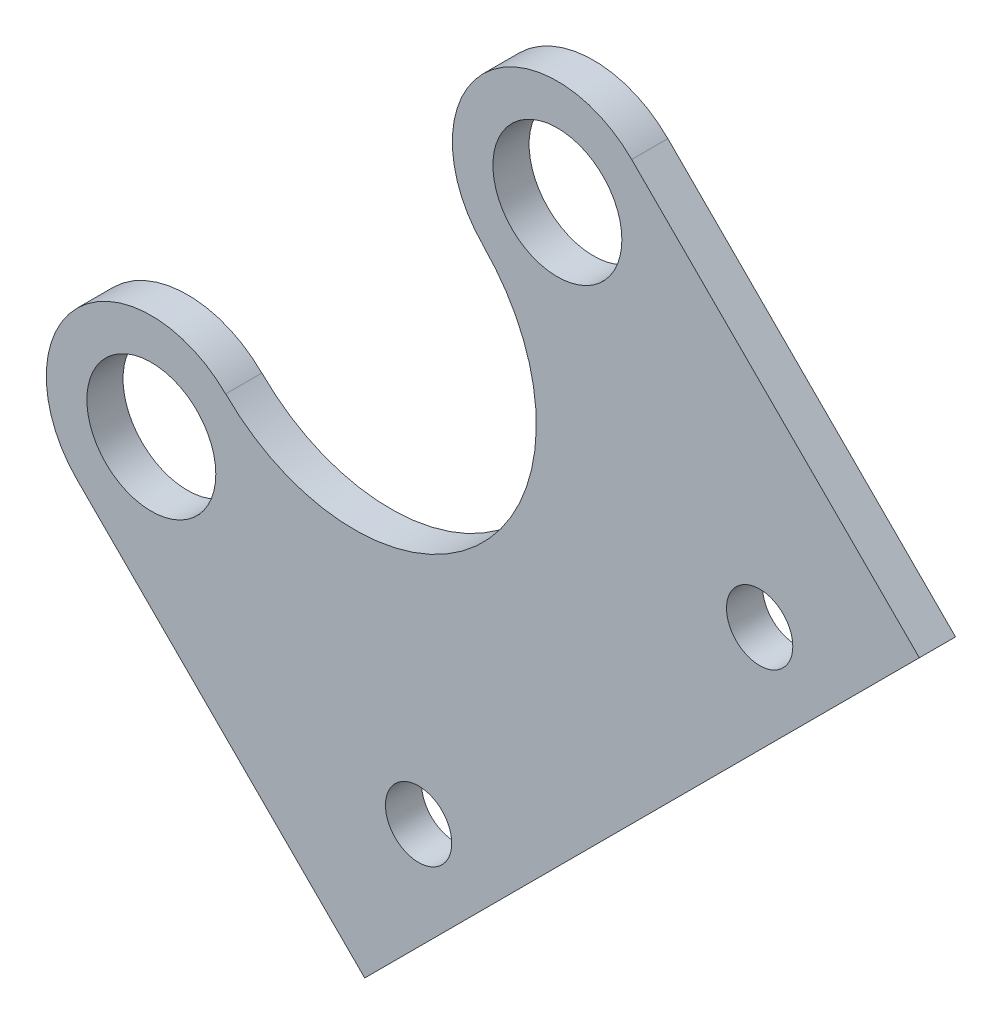
ISO-10303-21;
HEADER;
FILE_DESCRIPTION(('STEP AP214'),'2;1');
FILE_NAME('part.step','',(''),(''),'','','');
FILE_SCHEMA(('AUTOMOTIVE_DESIGN { 1 0 10303 214 1 1 1 1 }'));
ENDSEC;
DATA;
#1=APPLICATION_CONTEXT('core data for automotive mechanical design processes');
#2=APPLICATION_PROTOCOL_DEFINITION('international standard','automotive_design',2000,#1);
#3=PRODUCT_CONTEXT('',#1,'mechanical');
#4=PRODUCT('Part','Part','',(#3));
#5=PRODUCT_RELATED_PRODUCT_CATEGORY('part','',(#4));
#6=PRODUCT_DEFINITION_FORMATION('','',#4);
#7=PRODUCT_DEFINITION_CONTEXT('part definition',#1,'design');
#8=PRODUCT_DEFINITION('design','',#6,#7);
#9=PRODUCT_DEFINITION_SHAPE('','',#8);
#10=(LENGTH_UNIT() NAMED_UNIT(*) SI_UNIT(.MILLI.,.METRE.));
#11=(NAMED_UNIT(*) PLANE_ANGLE_UNIT() SI_UNIT($,.RADIAN.));
#12=(NAMED_UNIT(*) SI_UNIT($,.STERADIAN.) SOLID_ANGLE_UNIT());
#13=UNCERTAINTY_MEASURE_WITH_UNIT(LENGTH_MEASURE(1.E-05),#10,'distance_accuracy_value','');
#14=(GEOMETRIC_REPRESENTATION_CONTEXT(3) GLOBAL_UNCERTAINTY_ASSIGNED_CONTEXT((#13)) GLOBAL_UNIT_ASSIGNED_CONTEXT((#10,
#11,#12)) REPRESENTATION_CONTEXT('',''));
#15=CARTESIAN_POINT('',(0.,0.,0.));
#16=DIRECTION('',(0.,0.,1.));
#17=DIRECTION('',(1.,0.,0.));
#18=AXIS2_PLACEMENT_3D('',#15,#16,#17);
#19=CARTESIAN_POINT('',(-16.8379802270047,-16.8379802270047,3.));
#20=DIRECTION('',(0.,0.,1.));
#21=DIRECTION('',(1.,0.,0.));
#22=AXIS2_PLACEMENT_3D('',#19,#20,#21);
#23=PLANE('',#22);
#24=CARTESIAN_POINT('',(-16.8379802270047,-16.8379802270047,3.));
#25=DIRECTION('',(0.,0.,1.));
#26=DIRECTION('',(1.,0.,0.));
#27=AXIS2_PLACEMENT_3D('',#24,#25,#26);
#28=CIRCLE('',#27,5.34670000000001);
#29=CARTESIAN_POINT('',(-11.4912802270047,-16.8379802270047,3.));
#30=VERTEX_POINT('',#29);
#31=EDGE_CURVE('E192',#30,#30,#28,.T.);
#32=ORIENTED_EDGE('',*,*,#31,.F.);
#33=EDGE_LOOP('',(#32));
#34=FACE_BOUND('',#33,.T.);
#35=CARTESIAN_POINT('',(33.6101829523278,-5.29098062987499,3.));
#36=DIRECTION('',(0.,0.,1.));
#37=DIRECTION('',(1.,0.,0.));
#38=AXIS2_PLACEMENT_3D('',#35,#36,#37);
#39=CIRCLE('',#38,2.75000000000076);
#40=CARTESIAN_POINT('',(36.3601829523286,-5.29098062987499,3.));
#41=VERTEX_POINT('',#40);
#42=EDGE_CURVE('E138',#41,#41,#39,.T.);
#43=ORIENTED_EDGE('',*,*,#42,.F.);
#44=EDGE_LOOP('',(#43));
#45=FACE_BOUND('',#44,.T.);
#46=CARTESIAN_POINT('',(-16.8379802270047,-16.8379802270047,3.));
#47=DIRECTION('',(0.,0.,1.));
#48=DIRECTION('',(1.,0.,0.));
#49=AXIS2_PLACEMENT_3D('',#46,#47,#48);
#50=CIRCLE('',#49,8.7122);
#51=CARTESIAN_POINT('',(-10.6775245279513,-10.6775245279512,3.));
#52=VERTEX_POINT('',#51);
#53=CARTESIAN_POINT('',(-22.9984359260586,-22.9984359260576,3.));
#54=VERTEX_POINT('',#53);
#55=EDGE_CURVE('E149',#52,#54,#50,.T.);
#56=ORIENTED_EDGE('',*,*,#55,.T.);
#57=DIRECTION('',(0.707106781186551,-0.707106781186544,0.));
#58=VECTOR('',#57,1.);
#59=CARTESIAN_POINT('',(-22.9984359260586,-22.9984359260576,3.));
#60=LINE('',#59,#58);
#61=CARTESIAN_POINT('',(0.85903088640045,-46.8559027385164,3.));
#62=VERTEX_POINT('',#61);
#63=EDGE_CURVE('E97',#54,#62,#60,.T.);
#64=ORIENTED_EDGE('',*,*,#63,.T.);
#65=DIRECTION('',(0.707106781186548,0.707106781186548,0.));
#66=VECTOR('',#65,1.);
#67=CARTESIAN_POINT('',(0.85903088640045,-46.8559027385164,3.));
#68=LINE('',#67,#66);
#69=CARTESIAN_POINT('',(46.8559027385166,-0.859030886400325,3.));
#70=VERTEX_POINT('',#69);
#71=EDGE_CURVE('E164',#62,#70,#68,.T.);
#72=ORIENTED_EDGE('',*,*,#71,.T.);
#73=DIRECTION('',(-0.707106781186548,0.707106781186547,0.));
#74=VECTOR('',#73,1.);
#75=CARTESIAN_POINT('',(46.8559027385166,-0.859030886400325,3.));
#76=LINE('',#75,#74);
#77=CARTESIAN_POINT('',(22.9984359260583,22.9984359260579,3.));
#78=VERTEX_POINT('',#77);
#79=EDGE_CURVE('E177',#70,#78,#76,.T.);
#80=ORIENTED_EDGE('',*,*,#79,.T.);
#81=CARTESIAN_POINT('',(16.8379802270046,16.8379802270047,3.));
#82=DIRECTION('',(0.,0.,1.));
#83=DIRECTION('',(1.,0.,0.));
#84=AXIS2_PLACEMENT_3D('',#81,#82,#83);
#85=CIRCLE('',#84,8.71220000000001);
#86=CARTESIAN_POINT('',(10.6775245279512,10.6775245279512,3.));
#87=VERTEX_POINT('',#86);
#88=EDGE_CURVE('E116',#78,#87,#85,.T.);
#89=ORIENTED_EDGE('',*,*,#88,.T.);
#90=DIRECTION('',(-0.70710678118764,-0.707106781185455,0.));
#91=VECTOR('',#90,1.);
#92=CARTESIAN_POINT('',(10.6775245279512,10.6775245279512,3.));
#93=LINE('',#92,#91);
#94=CARTESIAN_POINT('',(10.6685442718301,10.6685442718302,3.));
#95=VERTEX_POINT('',#94);
#96=EDGE_CURVE('E110',#87,#95,#93,.T.);
#97=ORIENTED_EDGE('',*,*,#96,.T.);
#98=CARTESIAN_POINT('',(0.,0.,3.));
#99=DIRECTION('',(0.,0.,-1.));
#100=DIRECTION('',(1.,0.,0.));
#101=AXIS2_PLACEMENT_3D('',#98,#99,#100);
#102=CIRCLE('',#101,15.0876);
#103=CARTESIAN_POINT('',(-10.6685442718302,-10.6685442718301,3.));
#104=VERTEX_POINT('',#103);
#105=EDGE_CURVE('E114',#95,#104,#102,.T.);
#106=ORIENTED_EDGE('',*,*,#105,.T.);
#107=DIRECTION('',(-0.707106781186547,-0.707106781186547,0.));
#108=VECTOR('',#107,1.);
#109=CARTESIAN_POINT('',(-10.6685442718302,-10.6685442718301,3.));
#110=LINE('',#109,#108);
#111=EDGE_CURVE('E54',#104,#52,#110,.T.);
#112=ORIENTED_EDGE('',*,*,#111,.T.);
#113=EDGE_LOOP('',(#56,#64,#72,#80,#89,#97,#106,#112));
#114=FACE_BOUND('',#113,.T.);
#115=CARTESIAN_POINT('',(16.8379802270046,16.8379802270047,3.));
#116=DIRECTION('',(0.,0.,1.));
#117=DIRECTION('',(1.,0.,0.));
#118=AXIS2_PLACEMENT_3D('',#115,#116,#117);
#119=CIRCLE('',#118,5.34669999999999);
#120=CARTESIAN_POINT('',(22.1846802270046,16.8379802270047,3.));
#121=VERTEX_POINT('',#120);
#122=EDGE_CURVE('E186',#121,#121,#119,.T.);
#123=ORIENTED_EDGE('',*,*,#122,.F.);
#124=EDGE_LOOP('',(#123));
#125=FACE_BOUND('',#124,.T.);
#126=CARTESIAN_POINT('',(5.32591170486596,-33.5752518773369,3.));
#127=DIRECTION('',(0.,0.,1.));
#128=DIRECTION('',(1.,0.,0.));
#129=AXIS2_PLACEMENT_3D('',#126,#127,#128);
#130=CIRCLE('',#129,2.75000000000076);
#131=CARTESIAN_POINT('',(8.07591170486672,-33.5752518773369,3.));
#132=VERTEX_POINT('',#131);
#133=EDGE_CURVE('E198',#132,#132,#130,.T.);
#134=ORIENTED_EDGE('',*,*,#133,.F.);
#135=EDGE_LOOP('',(#134));
#136=FACE_BOUND('',#135,.T.);
#137=ADVANCED_FACE('F37',(#34,#45,#114,#125,#136),#23,.T.);
#138=CARTESIAN_POINT('',(-16.8379802270047,-16.8379802270047,0.));
#139=DIRECTION('',(0.,0.,1.));
#140=DIRECTION('',(1.,0.,0.));
#141=AXIS2_PLACEMENT_3D('',#138,#139,#140);
#142=PLANE('',#141);
#143=CARTESIAN_POINT('',(-16.8379802270047,-16.8379802270047,0.));
#144=DIRECTION('',(0.,0.,1.));
#145=DIRECTION('',(1.,0.,0.));
#146=AXIS2_PLACEMENT_3D('',#143,#144,#145);
#147=CIRCLE('',#146,8.7122);
#148=CARTESIAN_POINT('',(-10.6775245279513,-10.6775245279512,0.));
#149=VERTEX_POINT('',#148);
#150=CARTESIAN_POINT('',(-22.9984359260586,-22.9984359260576,0.));
#151=VERTEX_POINT('',#150);
#152=EDGE_CURVE('E134',#149,#151,#147,.T.);
#153=ORIENTED_EDGE('',*,*,#152,.F.);
#154=DIRECTION('',(-0.707106781186547,-0.707106781186547,0.));
#155=VECTOR('',#154,1.);
#156=CARTESIAN_POINT('',(-10.6685442718302,-10.6685442718301,0.));
#157=LINE('',#156,#155);
#158=CARTESIAN_POINT('',(-10.6685442718302,-10.6685442718301,0.));
#159=VERTEX_POINT('',#158);
#160=EDGE_CURVE('E89',#159,#149,#157,.T.);
#161=ORIENTED_EDGE('',*,*,#160,.F.);
#162=CARTESIAN_POINT('',(0.,0.,0.));
#163=DIRECTION('',(0.,0.,-1.));
#164=DIRECTION('',(1.,0.,0.));
#165=AXIS2_PLACEMENT_3D('',#162,#163,#164);
#166=CIRCLE('',#165,15.0876);
#167=CARTESIAN_POINT('',(10.6685442718301,10.6685442718302,0.));
#168=VERTEX_POINT('',#167);
#169=EDGE_CURVE('E83',#168,#159,#166,.T.);
#170=ORIENTED_EDGE('',*,*,#169,.F.);
#171=DIRECTION('',(-0.70710678118764,-0.707106781185455,0.));
#172=VECTOR('',#171,1.);
#173=CARTESIAN_POINT('',(10.6775245279512,10.6775245279512,0.));
#174=LINE('',#173,#172);
#175=CARTESIAN_POINT('',(10.6775245279512,10.6775245279512,0.));
#176=VERTEX_POINT('',#175);
#177=EDGE_CURVE('E124',#176,#168,#174,.T.);
#178=ORIENTED_EDGE('',*,*,#177,.F.);
#179=CARTESIAN_POINT('',(16.8379802270046,16.8379802270047,0.));
#180=DIRECTION('',(0.,0.,1.));
#181=DIRECTION('',(1.,0.,0.));
#182=AXIS2_PLACEMENT_3D('',#179,#180,#181);
#183=CIRCLE('',#182,8.71220000000001);
#184=CARTESIAN_POINT('',(22.9984359260583,22.9984359260579,0.));
#185=VERTEX_POINT('',#184);
#186=EDGE_CURVE('E144',#185,#176,#183,.T.);
#187=ORIENTED_EDGE('',*,*,#186,.F.);
#188=DIRECTION('',(-0.707106781186548,0.707106781186547,0.));
#189=VECTOR('',#188,1.);
#190=CARTESIAN_POINT('',(46.8559027385166,-0.859030886400325,0.));
#191=LINE('',#190,#189);
#192=CARTESIAN_POINT('',(46.8559027385166,-0.859030886400325,0.));
#193=VERTEX_POINT('',#192);
#194=EDGE_CURVE('E142',#193,#185,#191,.T.);
#195=ORIENTED_EDGE('',*,*,#194,.F.);
#196=DIRECTION('',(0.707106781186548,0.707106781186548,0.));
#197=VECTOR('',#196,1.);
#198=CARTESIAN_POINT('',(0.85903088640045,-46.8559027385164,0.));
#199=LINE('',#198,#197);
#200=CARTESIAN_POINT('',(0.85903088640045,-46.8559027385164,0.));
#201=VERTEX_POINT('',#200);
#202=EDGE_CURVE('E140',#201,#193,#199,.T.);
#203=ORIENTED_EDGE('',*,*,#202,.F.);
#204=DIRECTION('',(0.707106781186551,-0.707106781186544,0.));
#205=VECTOR('',#204,1.);
#206=CARTESIAN_POINT('',(-22.9984359260586,-22.9984359260576,0.));
#207=LINE('',#206,#205);
#208=EDGE_CURVE('E137',#151,#201,#207,.T.);
#209=ORIENTED_EDGE('',*,*,#208,.F.);
#210=EDGE_LOOP('',(#153,#161,#170,#178,#187,#195,#203,#209));
#211=FACE_BOUND('',#210,.T.);
#212=CARTESIAN_POINT('',(33.6101829523278,-5.29098062987499,0.));
#213=DIRECTION('',(0.,0.,1.));
#214=DIRECTION('',(1.,0.,0.));
#215=AXIS2_PLACEMENT_3D('',#212,#213,#214);
#216=CIRCLE('',#215,2.75000000000076);
#217=CARTESIAN_POINT('',(36.3601829523286,-5.29098062987499,0.));
#218=VERTEX_POINT('',#217);
#219=EDGE_CURVE('E183',#218,#218,#216,.T.);
#220=ORIENTED_EDGE('',*,*,#219,.T.);
#221=EDGE_LOOP('',(#220));
#222=FACE_BOUND('',#221,.T.);
#223=CARTESIAN_POINT('',(16.8379802270046,16.8379802270047,0.));
#224=DIRECTION('',(0.,0.,1.));
#225=DIRECTION('',(1.,0.,0.));
#226=AXIS2_PLACEMENT_3D('',#223,#224,#225);
#227=CIRCLE('',#226,5.34669999999999);
#228=CARTESIAN_POINT('',(22.1846802270046,16.8379802270047,0.));
#229=VERTEX_POINT('',#228);
#230=EDGE_CURVE('E189',#229,#229,#227,.T.);
#231=ORIENTED_EDGE('',*,*,#230,.T.);
#232=EDGE_LOOP('',(#231));
#233=FACE_BOUND('',#232,.T.);
#234=CARTESIAN_POINT('',(-16.8379802270047,-16.8379802270047,0.));
#235=DIRECTION('',(0.,0.,1.));
#236=DIRECTION('',(1.,0.,0.));
#237=AXIS2_PLACEMENT_3D('',#234,#235,#236);
#238=CIRCLE('',#237,5.34670000000001);
#239=CARTESIAN_POINT('',(-11.4912802270047,-16.8379802270047,0.));
#240=VERTEX_POINT('',#239);
#241=EDGE_CURVE('E195',#240,#240,#238,.T.);
#242=ORIENTED_EDGE('',*,*,#241,.T.);
#243=EDGE_LOOP('',(#242));
#244=FACE_BOUND('',#243,.T.);
#245=CARTESIAN_POINT('',(5.32591170486596,-33.5752518773369,0.));
#246=DIRECTION('',(0.,0.,1.));
#247=DIRECTION('',(1.,0.,0.));
#248=AXIS2_PLACEMENT_3D('',#245,#246,#247);
#249=CIRCLE('',#248,2.75000000000076);
#250=CARTESIAN_POINT('',(8.07591170486672,-33.5752518773369,0.));
#251=VERTEX_POINT('',#250);
#252=EDGE_CURVE('E201',#251,#251,#249,.T.);
#253=ORIENTED_EDGE('',*,*,#252,.T.);
#254=EDGE_LOOP('',(#253));
#255=FACE_BOUND('',#254,.T.);
#256=ADVANCED_FACE('F168',(#211,#222,#233,#244,#255),#142,.F.);
#257=CARTESIAN_POINT('',(-16.8379802270047,-16.8379802270047,3.));
#258=DIRECTION('',(0.,0.,-1.));
#259=DIRECTION('',(-1.,0.,0.));
#260=AXIS2_PLACEMENT_3D('',#257,#258,#259);
#261=CYLINDRICAL_SURFACE('',#260,8.7122);
#262=ORIENTED_EDGE('',*,*,#152,.T.);
#263=DIRECTION('',(0.,0.,-1.));
#264=VECTOR('',#263,1.);
#265=CARTESIAN_POINT('',(-22.9984359260586,-22.9984359260576,3.));
#266=LINE('',#265,#264);
#267=EDGE_CURVE('E11',#54,#151,#266,.T.);
#268=ORIENTED_EDGE('',*,*,#267,.F.);
#269=ORIENTED_EDGE('',*,*,#55,.F.);
#270=DIRECTION('',(0.,0.,-1.));
#271=VECTOR('',#270,1.);
#272=CARTESIAN_POINT('',(-10.6775245279513,-10.6775245279512,3.));
#273=LINE('',#272,#271);
#274=EDGE_CURVE('E130',#52,#149,#273,.T.);
#275=ORIENTED_EDGE('',*,*,#274,.T.);
#276=EDGE_LOOP('',(#262,#268,#269,#275));
#277=FACE_BOUND('',#276,.T.);
#278=ADVANCED_FACE('F39',(#277),#261,.T.);
#279=CARTESIAN_POINT('',(-22.9984359260586,-22.9984359260576,3.));
#280=DIRECTION('',(0.707106781186544,0.70710678118655,0.));
#281=DIRECTION('',(-0.707106781186551,0.707106781186545,0.));
#282=AXIS2_PLACEMENT_3D('',#279,#280,#281);
#283=PLANE('',#282);
#284=ORIENTED_EDGE('',*,*,#208,.T.);
#285=DIRECTION('',(0.,0.,-1.));
#286=VECTOR('',#285,1.);
#287=CARTESIAN_POINT('',(0.85903088640045,-46.8559027385164,3.));
#288=LINE('',#287,#286);
#289=EDGE_CURVE('E46',#62,#201,#288,.T.);
#290=ORIENTED_EDGE('',*,*,#289,.F.);
#291=ORIENTED_EDGE('',*,*,#63,.F.);
#292=ORIENTED_EDGE('',*,*,#267,.T.);
#293=EDGE_LOOP('',(#284,#290,#291,#292));
#294=FACE_BOUND('',#293,.T.);
#295=ADVANCED_FACE('F235',(#294),#283,.F.);
#296=CARTESIAN_POINT('',(0.85903088640045,-46.8559027385164,3.));
#297=DIRECTION('',(-0.707106781186547,0.707106781186547,0.));
#298=DIRECTION('',(-0.707106781186548,-0.707106781186548,0.));
#299=AXIS2_PLACEMENT_3D('',#296,#297,#298);
#300=PLANE('',#299);
#301=ORIENTED_EDGE('',*,*,#202,.T.);
#302=DIRECTION('',(0.,0.,-1.));
#303=VECTOR('',#302,1.);
#304=CARTESIAN_POINT('',(46.8559027385166,-0.859030886400325,3.));
#305=LINE('',#304,#303);
#306=EDGE_CURVE('E156',#70,#193,#305,.T.);
#307=ORIENTED_EDGE('',*,*,#306,.F.);
#308=ORIENTED_EDGE('',*,*,#71,.F.);
#309=ORIENTED_EDGE('',*,*,#289,.T.);
#310=EDGE_LOOP('',(#301,#307,#308,#309));
#311=FACE_BOUND('',#310,.T.);
#312=ADVANCED_FACE('F162',(#311),#300,.F.);
#313=CARTESIAN_POINT('',(46.8559027385166,-0.859030886400325,3.));
#314=DIRECTION('',(-0.707106781186547,-0.707106781186548,0.));
#315=DIRECTION('',(0.707106781186548,-0.707106781186547,0.));
#316=AXIS2_PLACEMENT_3D('',#313,#314,#315);
#317=PLANE('',#316);
#318=ORIENTED_EDGE('',*,*,#194,.T.);
#319=DIRECTION('',(0.,0.,-1.));
#320=VECTOR('',#319,1.);
#321=CARTESIAN_POINT('',(22.9984359260583,22.9984359260579,3.));
#322=LINE('',#321,#320);
#323=EDGE_CURVE('E153',#78,#185,#322,.T.);
#324=ORIENTED_EDGE('',*,*,#323,.F.);
#325=ORIENTED_EDGE('',*,*,#79,.F.);
#326=ORIENTED_EDGE('',*,*,#306,.T.);
#327=EDGE_LOOP('',(#318,#324,#325,#326));
#328=FACE_BOUND('',#327,.T.);
#329=ADVANCED_FACE('F173',(#328),#317,.F.);
#330=CARTESIAN_POINT('',(16.8379802270046,16.8379802270047,3.));
#331=DIRECTION('',(0.,0.,-1.));
#332=DIRECTION('',(-1.,0.,0.));
#333=AXIS2_PLACEMENT_3D('',#330,#331,#332);
#334=CYLINDRICAL_SURFACE('',#333,8.71220000000001);
#335=ORIENTED_EDGE('',*,*,#186,.T.);
#336=DIRECTION('',(0.,0.,-1.));
#337=VECTOR('',#336,1.);
#338=CARTESIAN_POINT('',(10.6775245279512,10.6775245279512,3.));
#339=LINE('',#338,#337);
#340=EDGE_CURVE('E125',#87,#176,#339,.T.);
#341=ORIENTED_EDGE('',*,*,#340,.F.);
#342=ORIENTED_EDGE('',*,*,#88,.F.);
#343=ORIENTED_EDGE('',*,*,#323,.T.);
#344=EDGE_LOOP('',(#335,#341,#342,#343));
#345=FACE_BOUND('',#344,.T.);
#346=ADVANCED_FACE('F176',(#345),#334,.T.);
#347=CARTESIAN_POINT('',(10.6775245279512,10.6775245279512,3.));
#348=DIRECTION('',(0.707106781185455,-0.70710678118764,0.));
#349=DIRECTION('',(0.70710678118764,0.707106781185455,0.));
#350=AXIS2_PLACEMENT_3D('',#347,#348,#349);
#351=PLANE('',#350);
#352=ORIENTED_EDGE('',*,*,#177,.T.);
#353=DIRECTION('',(0.,0.,-1.));
#354=VECTOR('',#353,1.);
#355=CARTESIAN_POINT('',(10.6685442718301,10.6685442718302,3.));
#356=LINE('',#355,#354);
#357=EDGE_CURVE('E121',#95,#168,#356,.T.);
#358=ORIENTED_EDGE('',*,*,#357,.F.);
#359=ORIENTED_EDGE('',*,*,#96,.F.);
#360=ORIENTED_EDGE('',*,*,#340,.T.);
#361=EDGE_LOOP('',(#352,#358,#359,#360));
#362=FACE_BOUND('',#361,.T.);
#363=ADVANCED_FACE('F122',(#362),#351,.F.);
#364=CARTESIAN_POINT('',(0.,0.,3.));
#365=DIRECTION('',(0.,0.,-1.));
#366=DIRECTION('',(-1.,0.,0.));
#367=AXIS2_PLACEMENT_3D('',#364,#365,#366);
#368=CYLINDRICAL_SURFACE('',#367,15.0876);
#369=ORIENTED_EDGE('',*,*,#169,.T.);
#370=DIRECTION('',(0.,0.,-1.));
#371=VECTOR('',#370,1.);
#372=CARTESIAN_POINT('',(-10.6685442718302,-10.6685442718301,3.));
#373=LINE('',#372,#371);
#374=EDGE_CURVE('E126',#104,#159,#373,.T.);
#375=ORIENTED_EDGE('',*,*,#374,.F.);
#376=ORIENTED_EDGE('',*,*,#105,.F.);
#377=ORIENTED_EDGE('',*,*,#357,.T.);
#378=EDGE_LOOP('',(#369,#375,#376,#377));
#379=FACE_BOUND('',#378,.T.);
#380=ADVANCED_FACE('F128',(#379),#368,.F.);
#381=CARTESIAN_POINT('',(-10.6685442718302,-10.6685442718301,3.));
#382=DIRECTION('',(0.707106781186548,-0.707106781186548,0.));
#383=DIRECTION('',(0.707106781186548,0.707106781186548,0.));
#384=AXIS2_PLACEMENT_3D('',#381,#382,#383);
#385=PLANE('',#384);
#386=ORIENTED_EDGE('',*,*,#160,.T.);
#387=ORIENTED_EDGE('',*,*,#274,.F.);
#388=ORIENTED_EDGE('',*,*,#111,.F.);
#389=ORIENTED_EDGE('',*,*,#374,.T.);
#390=EDGE_LOOP('',(#386,#387,#388,#389));
#391=FACE_BOUND('',#390,.T.);
#392=ADVANCED_FACE('F223',(#391),#385,.F.);
#393=CARTESIAN_POINT('',(33.6101829523278,-5.29098062987499,3.));
#394=DIRECTION('',(0.,0.,-1.));
#395=DIRECTION('',(-1.,0.,0.));
#396=AXIS2_PLACEMENT_3D('',#393,#394,#395);
#397=CYLINDRICAL_SURFACE('',#396,2.75000000000076);
#398=ORIENTED_EDGE('',*,*,#42,.T.);
#399=EDGE_LOOP('',(#398));
#400=FACE_BOUND('',#399,.T.);
#401=ORIENTED_EDGE('',*,*,#219,.F.);
#402=EDGE_LOOP('',(#401));
#403=FACE_BOUND('',#402,.T.);
#404=ADVANCED_FACE('F220',(#400,#403),#397,.F.);
#405=CARTESIAN_POINT('',(16.8379802270046,16.8379802270047,3.));
#406=DIRECTION('',(0.,0.,-1.));
#407=DIRECTION('',(-1.,0.,0.));
#408=AXIS2_PLACEMENT_3D('',#405,#406,#407);
#409=CYLINDRICAL_SURFACE('',#408,5.34669999999999);
#410=ORIENTED_EDGE('',*,*,#122,.T.);
#411=EDGE_LOOP('',(#410));
#412=FACE_BOUND('',#411,.T.);
#413=ORIENTED_EDGE('',*,*,#230,.F.);
#414=EDGE_LOOP('',(#413));
#415=FACE_BOUND('',#414,.T.);
#416=ADVANCED_FACE('F311',(#412,#415),#409,.F.);
#417=CARTESIAN_POINT('',(-16.8379802270047,-16.8379802270047,3.));
#418=DIRECTION('',(0.,0.,-1.));
#419=DIRECTION('',(-1.,0.,0.));
#420=AXIS2_PLACEMENT_3D('',#417,#418,#419);
#421=CYLINDRICAL_SURFACE('',#420,5.34670000000001);
#422=ORIENTED_EDGE('',*,*,#31,.T.);
#423=EDGE_LOOP('',(#422));
#424=FACE_BOUND('',#423,.T.);
#425=ORIENTED_EDGE('',*,*,#241,.F.);
#426=EDGE_LOOP('',(#425));
#427=FACE_BOUND('',#426,.T.);
#428=ADVANCED_FACE('F320',(#424,#427),#421,.F.);
#429=CARTESIAN_POINT('',(5.32591170486596,-33.5752518773369,3.));
#430=DIRECTION('',(0.,0.,-1.));
#431=DIRECTION('',(-1.,0.,0.));
#432=AXIS2_PLACEMENT_3D('',#429,#430,#431);
#433=CYLINDRICAL_SURFACE('',#432,2.75000000000076);
#434=ORIENTED_EDGE('',*,*,#133,.T.);
#435=EDGE_LOOP('',(#434));
#436=FACE_BOUND('',#435,.T.);
#437=ORIENTED_EDGE('',*,*,#252,.F.);
#438=EDGE_LOOP('',(#437));
#439=FACE_BOUND('',#438,.T.);
#440=ADVANCED_FACE('F207',(#436,#439),#433,.F.);
#441=CLOSED_SHELL('',(#137,#256,#278,#295,#312,#329,#346,#363,#380,#392,#404,#416,#428,#440));
#442=MANIFOLD_SOLID_BREP('B2',#441);
#443=ADVANCED_BREP_SHAPE_REPRESENTATION('',(#18,#442),#14);
#444=SHAPE_DEFINITION_REPRESENTATION(#9,#443);
ENDSEC;
END-ISO-10303-21;
